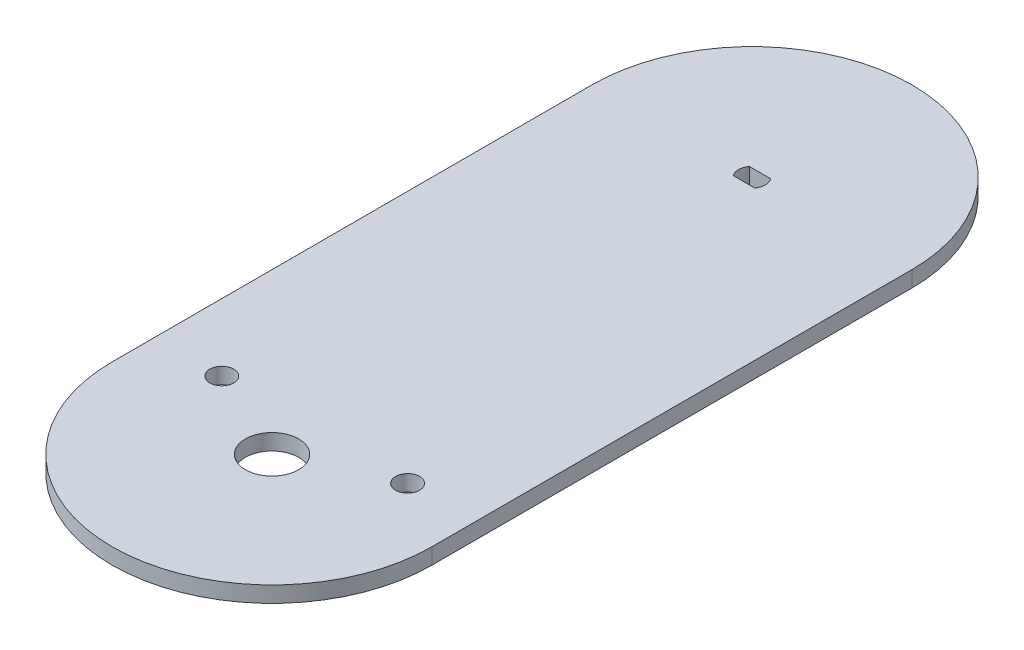
ISO-10303-21;
HEADER;
FILE_DESCRIPTION(('STEP AP214'),'2;1');
FILE_NAME('part.step','',(''),(''),'','','');
FILE_SCHEMA(('AUTOMOTIVE_DESIGN { 1 0 10303 214 1 1 1 1 }'));
ENDSEC;
DATA;
#1=APPLICATION_CONTEXT('core data for automotive mechanical design processes');
#2=APPLICATION_PROTOCOL_DEFINITION('international standard','automotive_design',2000,#1);
#3=PRODUCT_CONTEXT('',#1,'mechanical');
#4=PRODUCT('Part','Part','',(#3));
#5=PRODUCT_RELATED_PRODUCT_CATEGORY('part','',(#4));
#6=PRODUCT_DEFINITION_FORMATION('','',#4);
#7=PRODUCT_DEFINITION_CONTEXT('part definition',#1,'design');
#8=PRODUCT_DEFINITION('design','',#6,#7);
#9=PRODUCT_DEFINITION_SHAPE('','',#8);
#10=(LENGTH_UNIT() NAMED_UNIT(*) SI_UNIT(.MILLI.,.METRE.));
#11=(NAMED_UNIT(*) PLANE_ANGLE_UNIT() SI_UNIT($,.RADIAN.));
#12=(NAMED_UNIT(*) SI_UNIT($,.STERADIAN.) SOLID_ANGLE_UNIT());
#13=UNCERTAINTY_MEASURE_WITH_UNIT(LENGTH_MEASURE(1.E-05),#10,'distance_accuracy_value','');
#14=(GEOMETRIC_REPRESENTATION_CONTEXT(3) GLOBAL_UNCERTAINTY_ASSIGNED_CONTEXT((#13)) GLOBAL_UNIT_ASSIGNED_CONTEXT((#10,
#11,#12)) REPRESENTATION_CONTEXT('',''));
#15=CARTESIAN_POINT('',(0.,0.,0.));
#16=DIRECTION('',(0.,0.,1.));
#17=DIRECTION('',(1.,0.,0.));
#18=AXIS2_PLACEMENT_3D('',#15,#16,#17);
#19=CARTESIAN_POINT('',(0.,3.,0.));
#20=DIRECTION('',(0.,1.,0.));
#21=DIRECTION('',(0.,0.,1.));
#22=AXIS2_PLACEMENT_3D('',#19,#20,#21);
#23=PLANE('',#22);
#24=DIRECTION('',(-1.,0.,0.));
#25=VECTOR('',#24,1.);
#26=CARTESIAN_POINT('',(-2.,3.,-1.5));
#27=LINE('',#26,#25);
#28=CARTESIAN_POINT('',(2.,3.,-1.5));
#29=VERTEX_POINT('',#28);
#30=CARTESIAN_POINT('',(-2.,3.,-1.5));
#31=VERTEX_POINT('',#30);
#32=EDGE_CURVE('E132',#29,#31,#27,.T.);
#33=ORIENTED_EDGE('',*,*,#32,.F.);
#34=CARTESIAN_POINT('',(0.,3.,0.));
#35=DIRECTION('',(0.,1.,0.));
#36=DIRECTION('',(0.,0.,1.));
#37=AXIS2_PLACEMENT_3D('',#34,#35,#36);
#38=CIRCLE('',#37,2.5);
#39=CARTESIAN_POINT('',(2.,3.,1.5));
#40=VERTEX_POINT('',#39);
#41=EDGE_CURVE('E123',#40,#29,#38,.T.);
#42=ORIENTED_EDGE('',*,*,#41,.F.);
#43=DIRECTION('',(1.,0.,0.));
#44=VECTOR('',#43,1.);
#45=CARTESIAN_POINT('',(-2.,3.,1.5));
#46=LINE('',#45,#44);
#47=CARTESIAN_POINT('',(-2.,3.,1.5));
#48=VERTEX_POINT('',#47);
#49=EDGE_CURVE('E150',#48,#40,#46,.T.);
#50=ORIENTED_EDGE('',*,*,#49,.F.);
#51=CARTESIAN_POINT('',(0.,3.,0.));
#52=DIRECTION('',(0.,1.,0.));
#53=DIRECTION('',(0.,0.,1.));
#54=AXIS2_PLACEMENT_3D('',#51,#52,#53);
#55=CIRCLE('',#54,2.5);
#56=EDGE_CURVE('E146',#31,#48,#55,.T.);
#57=ORIENTED_EDGE('',*,*,#56,.F.);
#58=EDGE_LOOP('',(#33,#42,#50,#57));
#59=FACE_BOUND('',#58,.T.);
#60=CARTESIAN_POINT('',(-17.425,3.,82.));
#61=DIRECTION('',(0.,1.,0.));
#62=DIRECTION('',(0.,0.,1.));
#63=AXIS2_PLACEMENT_3D('',#60,#61,#62);
#64=CIRCLE('',#63,2.25);
#65=CARTESIAN_POINT('',(-17.425,3.,84.25));
#66=VERTEX_POINT('',#65);
#67=EDGE_CURVE('E174',#66,#66,#64,.T.);
#68=ORIENTED_EDGE('',*,*,#67,.F.);
#69=EDGE_LOOP('',(#68));
#70=FACE_BOUND('',#69,.T.);
#71=CARTESIAN_POINT('',(0.,3.,0.));
#72=DIRECTION('',(0.,1.,0.));
#73=DIRECTION('',(0.,0.,1.));
#74=AXIS2_PLACEMENT_3D('',#71,#72,#73);
#75=CIRCLE('',#74,30.);
#76=CARTESIAN_POINT('',(30.,3.,0.));
#77=VERTEX_POINT('',#76);
#78=CARTESIAN_POINT('',(-30.,3.,0.));
#79=VERTEX_POINT('',#78);
#80=EDGE_CURVE('E190',#77,#79,#75,.T.);
#81=ORIENTED_EDGE('',*,*,#80,.T.);
#82=DIRECTION('',(0.,0.,1.));
#83=VECTOR('',#82,1.);
#84=CARTESIAN_POINT('',(-30.,3.,0.));
#85=LINE('',#84,#83);
#86=CARTESIAN_POINT('',(-30.,3.,90.));
#87=VERTEX_POINT('',#86);
#88=EDGE_CURVE('E194',#79,#87,#85,.T.);
#89=ORIENTED_EDGE('',*,*,#88,.T.);
#90=CARTESIAN_POINT('',(0.,3.,90.));
#91=DIRECTION('',(0.,1.,0.));
#92=DIRECTION('',(0.,0.,1.));
#93=AXIS2_PLACEMENT_3D('',#90,#91,#92);
#94=CIRCLE('',#93,30.);
#95=CARTESIAN_POINT('',(30.,3.,90.));
#96=VERTEX_POINT('',#95);
#97=EDGE_CURVE('E198',#87,#96,#94,.T.);
#98=ORIENTED_EDGE('',*,*,#97,.T.);
#99=DIRECTION('',(0.,0.,-1.));
#100=VECTOR('',#99,1.);
#101=CARTESIAN_POINT('',(30.,3.,0.));
#102=LINE('',#101,#100);
#103=EDGE_CURVE('E201',#96,#77,#102,.T.);
#104=ORIENTED_EDGE('',*,*,#103,.T.);
#105=EDGE_LOOP('',(#81,#89,#98,#104));
#106=FACE_BOUND('',#105,.T.);
#107=CARTESIAN_POINT('',(0.,3.,90.));
#108=DIRECTION('',(0.,1.,0.));
#109=DIRECTION('',(0.,0.,1.));
#110=AXIS2_PLACEMENT_3D('',#107,#108,#109);
#111=CIRCLE('',#110,5.);
#112=CARTESIAN_POINT('',(0.,3.,95.));
#113=VERTEX_POINT('',#112);
#114=EDGE_CURVE('E182',#113,#113,#111,.T.);
#115=ORIENTED_EDGE('',*,*,#114,.F.);
#116=EDGE_LOOP('',(#115));
#117=FACE_BOUND('',#116,.T.);
#118=CARTESIAN_POINT('',(17.425,3.,82.));
#119=DIRECTION('',(0.,1.,0.));
#120=DIRECTION('',(0.,0.,1.));
#121=AXIS2_PLACEMENT_3D('',#118,#119,#120);
#122=CIRCLE('',#121,2.25);
#123=CARTESIAN_POINT('',(17.425,3.,84.25));
#124=VERTEX_POINT('',#123);
#125=EDGE_CURVE('E158',#124,#124,#122,.T.);
#126=ORIENTED_EDGE('',*,*,#125,.F.);
#127=EDGE_LOOP('',(#126));
#128=FACE_BOUND('',#127,.T.);
#129=ADVANCED_FACE('F43',(#59,#70,#106,#117,#128),#23,.T.);
#130=CARTESIAN_POINT('',(0.,0.,0.));
#131=DIRECTION('',(0.,1.,0.));
#132=DIRECTION('',(0.,0.,1.));
#133=AXIS2_PLACEMENT_3D('',#130,#131,#132);
#134=PLANE('',#133);
#135=CARTESIAN_POINT('',(-17.425,0.,82.));
#136=DIRECTION('',(0.,1.,0.));
#137=DIRECTION('',(0.,0.,1.));
#138=AXIS2_PLACEMENT_3D('',#135,#136,#137);
#139=CIRCLE('',#138,2.25);
#140=CARTESIAN_POINT('',(-17.425,0.,84.25));
#141=VERTEX_POINT('',#140);
#142=EDGE_CURVE('E141',#141,#141,#139,.T.);
#143=ORIENTED_EDGE('',*,*,#142,.T.);
#144=EDGE_LOOP('',(#143));
#145=FACE_BOUND('',#144,.T.);
#146=CARTESIAN_POINT('',(0.,0.,90.));
#147=DIRECTION('',(0.,1.,0.));
#148=DIRECTION('',(0.,0.,1.));
#149=AXIS2_PLACEMENT_3D('',#146,#147,#148);
#150=CIRCLE('',#149,5.);
#151=CARTESIAN_POINT('',(0.,0.,95.));
#152=VERTEX_POINT('',#151);
#153=EDGE_CURVE('E178',#152,#152,#150,.T.);
#154=ORIENTED_EDGE('',*,*,#153,.T.);
#155=EDGE_LOOP('',(#154));
#156=FACE_BOUND('',#155,.T.);
#157=CARTESIAN_POINT('',(0.,0.,0.));
#158=DIRECTION('',(0.,1.,0.));
#159=DIRECTION('',(0.,0.,1.));
#160=AXIS2_PLACEMENT_3D('',#157,#158,#159);
#161=CIRCLE('',#160,30.);
#162=CARTESIAN_POINT('',(30.,0.,0.));
#163=VERTEX_POINT('',#162);
#164=CARTESIAN_POINT('',(-30.,0.,0.));
#165=VERTEX_POINT('',#164);
#166=EDGE_CURVE('E186',#163,#165,#161,.T.);
#167=ORIENTED_EDGE('',*,*,#166,.F.);
#168=DIRECTION('',(0.,0.,-1.));
#169=VECTOR('',#168,1.);
#170=CARTESIAN_POINT('',(30.,0.,0.));
#171=LINE('',#170,#169);
#172=CARTESIAN_POINT('',(30.,0.,90.));
#173=VERTEX_POINT('',#172);
#174=EDGE_CURVE('E195',#173,#163,#171,.T.);
#175=ORIENTED_EDGE('',*,*,#174,.F.);
#176=CARTESIAN_POINT('',(0.,0.,90.));
#177=DIRECTION('',(0.,1.,0.));
#178=DIRECTION('',(0.,0.,1.));
#179=AXIS2_PLACEMENT_3D('',#176,#177,#178);
#180=CIRCLE('',#179,30.);
#181=CARTESIAN_POINT('',(-30.,0.,90.));
#182=VERTEX_POINT('',#181);
#183=EDGE_CURVE('E211',#182,#173,#180,.T.);
#184=ORIENTED_EDGE('',*,*,#183,.F.);
#185=DIRECTION('',(0.,0.,1.));
#186=VECTOR('',#185,1.);
#187=CARTESIAN_POINT('',(-30.,0.,0.));
#188=LINE('',#187,#186);
#189=EDGE_CURVE('E208',#165,#182,#188,.T.);
#190=ORIENTED_EDGE('',*,*,#189,.F.);
#191=EDGE_LOOP('',(#167,#175,#184,#190));
#192=FACE_BOUND('',#191,.T.);
#193=CARTESIAN_POINT('',(0.,0.,0.));
#194=DIRECTION('',(0.,1.,0.));
#195=DIRECTION('',(0.,0.,1.));
#196=AXIS2_PLACEMENT_3D('',#193,#194,#195);
#197=CIRCLE('',#196,2.5);
#198=CARTESIAN_POINT('',(2.,0.,1.5));
#199=VERTEX_POINT('',#198);
#200=CARTESIAN_POINT('',(2.,0.,-1.5));
#201=VERTEX_POINT('',#200);
#202=EDGE_CURVE('E73',#199,#201,#197,.T.);
#203=ORIENTED_EDGE('',*,*,#202,.T.);
#204=DIRECTION('',(-1.,0.,0.));
#205=VECTOR('',#204,1.);
#206=CARTESIAN_POINT('',(-2.,0.,-1.5));
#207=LINE('',#206,#205);
#208=CARTESIAN_POINT('',(-2.,0.,-1.5));
#209=VERTEX_POINT('',#208);
#210=EDGE_CURVE('E139',#201,#209,#207,.T.);
#211=ORIENTED_EDGE('',*,*,#210,.T.);
#212=CARTESIAN_POINT('',(0.,0.,0.));
#213=DIRECTION('',(0.,1.,0.));
#214=DIRECTION('',(0.,0.,1.));
#215=AXIS2_PLACEMENT_3D('',#212,#213,#214);
#216=CIRCLE('',#215,2.5);
#217=CARTESIAN_POINT('',(-2.,0.,1.5));
#218=VERTEX_POINT('',#217);
#219=EDGE_CURVE('E161',#209,#218,#216,.T.);
#220=ORIENTED_EDGE('',*,*,#219,.T.);
#221=DIRECTION('',(1.,0.,0.));
#222=VECTOR('',#221,1.);
#223=CARTESIAN_POINT('',(-2.,0.,1.5));
#224=LINE('',#223,#222);
#225=EDGE_CURVE('E133',#218,#199,#224,.T.);
#226=ORIENTED_EDGE('',*,*,#225,.T.);
#227=EDGE_LOOP('',(#203,#211,#220,#226));
#228=FACE_BOUND('',#227,.T.);
#229=CARTESIAN_POINT('',(17.425,0.,82.));
#230=DIRECTION('',(0.,1.,0.));
#231=DIRECTION('',(0.,0.,1.));
#232=AXIS2_PLACEMENT_3D('',#229,#230,#231);
#233=CIRCLE('',#232,2.25);
#234=CARTESIAN_POINT('',(17.425,0.,84.25));
#235=VERTEX_POINT('',#234);
#236=EDGE_CURVE('E282',#235,#235,#233,.T.);
#237=ORIENTED_EDGE('',*,*,#236,.T.);
#238=EDGE_LOOP('',(#237));
#239=FACE_BOUND('',#238,.T.);
#240=ADVANCED_FACE('F234',(#145,#156,#192,#228,#239),#134,.F.);
#241=CARTESIAN_POINT('',(0.,3.,0.));
#242=DIRECTION('',(0.,-1.,0.));
#243=DIRECTION('',(0.,0.,-1.));
#244=AXIS2_PLACEMENT_3D('',#241,#242,#243);
#245=CYLINDRICAL_SURFACE('',#244,30.);
#246=ORIENTED_EDGE('',*,*,#166,.T.);
#247=DIRECTION('',(0.,-1.,0.));
#248=VECTOR('',#247,1.);
#249=CARTESIAN_POINT('',(-30.,3.,0.));
#250=LINE('',#249,#248);
#251=EDGE_CURVE('E11',#79,#165,#250,.T.);
#252=ORIENTED_EDGE('',*,*,#251,.F.);
#253=ORIENTED_EDGE('',*,*,#80,.F.);
#254=DIRECTION('',(0.,-1.,0.));
#255=VECTOR('',#254,1.);
#256=CARTESIAN_POINT('',(30.,3.,0.));
#257=LINE('',#256,#255);
#258=EDGE_CURVE('E204',#77,#163,#257,.T.);
#259=ORIENTED_EDGE('',*,*,#258,.T.);
#260=EDGE_LOOP('',(#246,#252,#253,#259));
#261=FACE_BOUND('',#260,.T.);
#262=ADVANCED_FACE('F45',(#261),#245,.T.);
#263=CARTESIAN_POINT('',(-30.,3.,0.));
#264=DIRECTION('',(1.,0.,0.));
#265=DIRECTION('',(0.,0.,-1.));
#266=AXIS2_PLACEMENT_3D('',#263,#264,#265);
#267=PLANE('',#266);
#268=ORIENTED_EDGE('',*,*,#189,.T.);
#269=DIRECTION('',(0.,-1.,0.));
#270=VECTOR('',#269,1.);
#271=CARTESIAN_POINT('',(-30.,3.,90.));
#272=LINE('',#271,#270);
#273=EDGE_CURVE('E52',#87,#182,#272,.T.);
#274=ORIENTED_EDGE('',*,*,#273,.F.);
#275=ORIENTED_EDGE('',*,*,#88,.F.);
#276=ORIENTED_EDGE('',*,*,#251,.T.);
#277=EDGE_LOOP('',(#268,#274,#275,#276));
#278=FACE_BOUND('',#277,.T.);
#279=ADVANCED_FACE('F245',(#278),#267,.F.);
#280=CARTESIAN_POINT('',(0.,3.,90.));
#281=DIRECTION('',(0.,-1.,0.));
#282=DIRECTION('',(0.,0.,-1.));
#283=AXIS2_PLACEMENT_3D('',#280,#281,#282);
#284=CYLINDRICAL_SURFACE('',#283,30.);
#285=ORIENTED_EDGE('',*,*,#183,.T.);
#286=DIRECTION('',(0.,-1.,0.));
#287=VECTOR('',#286,1.);
#288=CARTESIAN_POINT('',(30.,3.,90.));
#289=LINE('',#288,#287);
#290=EDGE_CURVE('E219',#96,#173,#289,.T.);
#291=ORIENTED_EDGE('',*,*,#290,.F.);
#292=ORIENTED_EDGE('',*,*,#97,.F.);
#293=ORIENTED_EDGE('',*,*,#273,.T.);
#294=EDGE_LOOP('',(#285,#291,#292,#293));
#295=FACE_BOUND('',#294,.T.);
#296=ADVANCED_FACE('F228',(#295),#284,.T.);
#297=CARTESIAN_POINT('',(30.,3.,0.));
#298=DIRECTION('',(-1.,0.,0.));
#299=DIRECTION('',(0.,0.,1.));
#300=AXIS2_PLACEMENT_3D('',#297,#298,#299);
#301=PLANE('',#300);
#302=ORIENTED_EDGE('',*,*,#174,.T.);
#303=ORIENTED_EDGE('',*,*,#258,.F.);
#304=ORIENTED_EDGE('',*,*,#103,.F.);
#305=ORIENTED_EDGE('',*,*,#290,.T.);
#306=EDGE_LOOP('',(#302,#303,#304,#305));
#307=FACE_BOUND('',#306,.T.);
#308=ADVANCED_FACE('F238',(#307),#301,.F.);
#309=CARTESIAN_POINT('',(0.,3.,90.));
#310=DIRECTION('',(0.,-1.,0.));
#311=DIRECTION('',(0.,0.,-1.));
#312=AXIS2_PLACEMENT_3D('',#309,#310,#311);
#313=CYLINDRICAL_SURFACE('',#312,5.);
#314=ORIENTED_EDGE('',*,*,#114,.T.);
#315=EDGE_LOOP('',(#314));
#316=FACE_BOUND('',#315,.T.);
#317=ORIENTED_EDGE('',*,*,#153,.F.);
#318=EDGE_LOOP('',(#317));
#319=FACE_BOUND('',#318,.T.);
#320=ADVANCED_FACE('F260',(#316,#319),#313,.F.);
#321=CARTESIAN_POINT('',(-17.425,3.,82.));
#322=DIRECTION('',(0.,-1.,0.));
#323=DIRECTION('',(0.,0.,-1.));
#324=AXIS2_PLACEMENT_3D('',#321,#322,#323);
#325=CYLINDRICAL_SURFACE('',#324,2.25);
#326=ORIENTED_EDGE('',*,*,#67,.T.);
#327=EDGE_LOOP('',(#326));
#328=FACE_BOUND('',#327,.T.);
#329=ORIENTED_EDGE('',*,*,#142,.F.);
#330=EDGE_LOOP('',(#329));
#331=FACE_BOUND('',#330,.T.);
#332=ADVANCED_FACE('F267',(#328,#331),#325,.F.);
#333=CARTESIAN_POINT('',(0.,3.,0.));
#334=DIRECTION('',(0.,-1.,0.));
#335=DIRECTION('',(0.,0.,-1.));
#336=AXIS2_PLACEMENT_3D('',#333,#334,#335);
#337=CYLINDRICAL_SURFACE('',#336,2.5);
#338=ORIENTED_EDGE('',*,*,#202,.F.);
#339=DIRECTION('',(0.,-1.,0.));
#340=VECTOR('',#339,1.);
#341=CARTESIAN_POINT('',(2.,3.,1.5));
#342=LINE('',#341,#340);
#343=EDGE_CURVE('E127',#40,#199,#342,.T.);
#344=ORIENTED_EDGE('',*,*,#343,.F.);
#345=ORIENTED_EDGE('',*,*,#41,.T.);
#346=DIRECTION('',(0.,-1.,0.));
#347=VECTOR('',#346,1.);
#348=CARTESIAN_POINT('',(2.,3.,-1.5));
#349=LINE('',#348,#347);
#350=EDGE_CURVE('E126',#29,#201,#349,.T.);
#351=ORIENTED_EDGE('',*,*,#350,.T.);
#352=EDGE_LOOP('',(#338,#344,#345,#351));
#353=FACE_BOUND('',#352,.T.);
#354=ADVANCED_FACE('F125',(#353),#337,.F.);
#355=CARTESIAN_POINT('',(-2.,3.,-1.5));
#356=DIRECTION('',(0.,0.,1.));
#357=DIRECTION('',(1.,0.,0.));
#358=AXIS2_PLACEMENT_3D('',#355,#356,#357);
#359=PLANE('',#358);
#360=ORIENTED_EDGE('',*,*,#210,.F.);
#361=ORIENTED_EDGE('',*,*,#350,.F.);
#362=ORIENTED_EDGE('',*,*,#32,.T.);
#363=DIRECTION('',(0.,-1.,0.));
#364=VECTOR('',#363,1.);
#365=CARTESIAN_POINT('',(-2.,3.,-1.5));
#366=LINE('',#365,#364);
#367=EDGE_CURVE('E142',#31,#209,#366,.T.);
#368=ORIENTED_EDGE('',*,*,#367,.T.);
#369=EDGE_LOOP('',(#360,#361,#362,#368));
#370=FACE_BOUND('',#369,.T.);
#371=ADVANCED_FACE('F136',(#370),#359,.T.);
#372=CARTESIAN_POINT('',(0.,3.,0.));
#373=DIRECTION('',(0.,-1.,0.));
#374=DIRECTION('',(0.,0.,-1.));
#375=AXIS2_PLACEMENT_3D('',#372,#373,#374);
#376=CYLINDRICAL_SURFACE('',#375,2.5);
#377=ORIENTED_EDGE('',*,*,#219,.F.);
#378=ORIENTED_EDGE('',*,*,#367,.F.);
#379=ORIENTED_EDGE('',*,*,#56,.T.);
#380=DIRECTION('',(0.,-1.,0.));
#381=VECTOR('',#380,1.);
#382=CARTESIAN_POINT('',(-2.,3.,1.5));
#383=LINE('',#382,#381);
#384=EDGE_CURVE('E62',#48,#218,#383,.T.);
#385=ORIENTED_EDGE('',*,*,#384,.T.);
#386=EDGE_LOOP('',(#377,#378,#379,#385));
#387=FACE_BOUND('',#386,.T.);
#388=ADVANCED_FACE('F296',(#387),#376,.F.);
#389=CARTESIAN_POINT('',(-2.,3.,1.5));
#390=DIRECTION('',(0.,0.,-1.));
#391=DIRECTION('',(-1.,0.,0.));
#392=AXIS2_PLACEMENT_3D('',#389,#390,#391);
#393=PLANE('',#392);
#394=ORIENTED_EDGE('',*,*,#225,.F.);
#395=ORIENTED_EDGE('',*,*,#384,.F.);
#396=ORIENTED_EDGE('',*,*,#49,.T.);
#397=ORIENTED_EDGE('',*,*,#343,.T.);
#398=EDGE_LOOP('',(#394,#395,#396,#397));
#399=FACE_BOUND('',#398,.T.);
#400=ADVANCED_FACE('F291',(#399),#393,.T.);
#401=CARTESIAN_POINT('',(17.425,3.,82.));
#402=DIRECTION('',(0.,-1.,0.));
#403=DIRECTION('',(0.,0.,-1.));
#404=AXIS2_PLACEMENT_3D('',#401,#402,#403);
#405=CYLINDRICAL_SURFACE('',#404,2.25);
#406=ORIENTED_EDGE('',*,*,#125,.T.);
#407=EDGE_LOOP('',(#406));
#408=FACE_BOUND('',#407,.T.);
#409=ORIENTED_EDGE('',*,*,#236,.F.);
#410=EDGE_LOOP('',(#409));
#411=FACE_BOUND('',#410,.T.);
#412=ADVANCED_FACE('F289',(#408,#411),#405,.F.);
#413=CLOSED_SHELL('',(#129,#240,#262,#279,#296,#308,#320,#332,#354,#371,#388,#400,#412));
#414=MANIFOLD_SOLID_BREP('B2',#413);
#415=ADVANCED_BREP_SHAPE_REPRESENTATION('',(#18,#414),#14);
#416=SHAPE_DEFINITION_REPRESENTATION(#9,#415);
ENDSEC;
END-ISO-10303-21;
